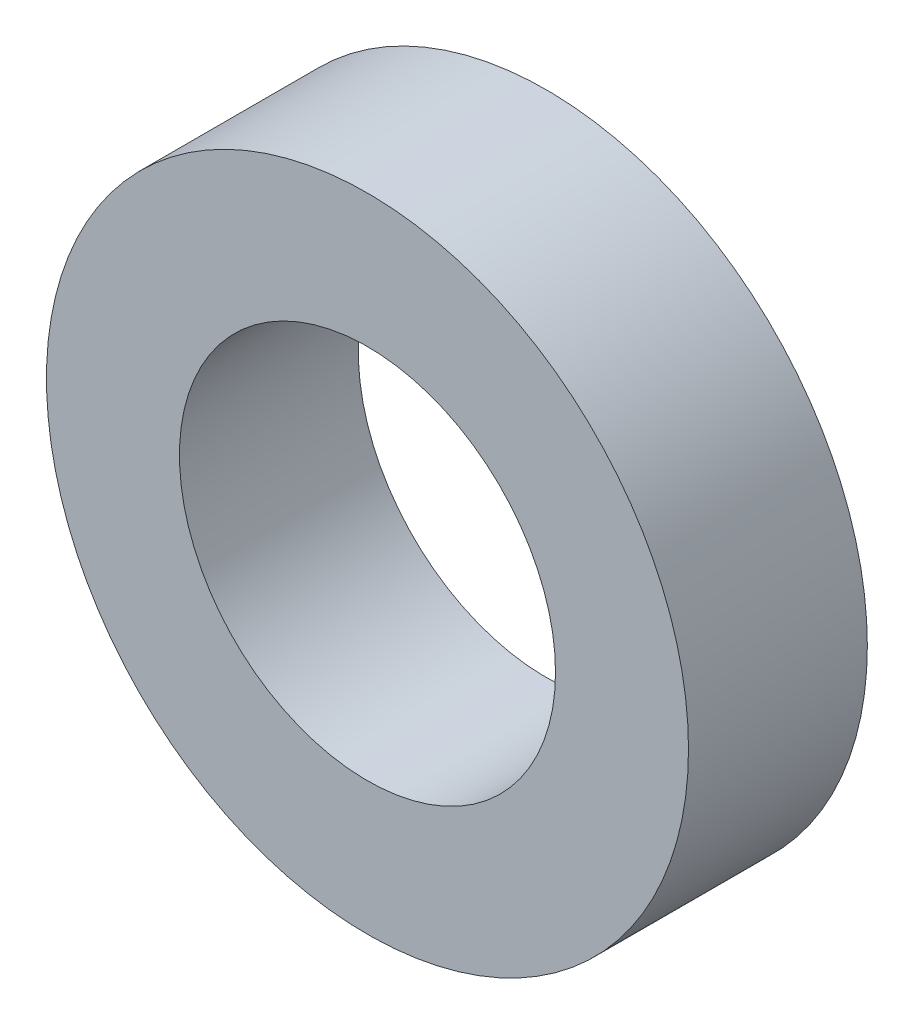
ISO-10303-21;
HEADER;
FILE_DESCRIPTION(('STEP AP214'),'2;1');
FILE_NAME('part.step','',(''),(''),'','','');
FILE_SCHEMA(('AUTOMOTIVE_DESIGN { 1 0 10303 214 1 1 1 1 }'));
ENDSEC;
DATA;
#1=APPLICATION_CONTEXT('core data for automotive mechanical design processes');
#2=APPLICATION_PROTOCOL_DEFINITION('international standard','automotive_design',2000,#1);
#3=PRODUCT_CONTEXT('',#1,'mechanical');
#4=PRODUCT('Part','Part','',(#3));
#5=PRODUCT_RELATED_PRODUCT_CATEGORY('part','',(#4));
#6=PRODUCT_DEFINITION_FORMATION('','',#4);
#7=PRODUCT_DEFINITION_CONTEXT('part definition',#1,'design');
#8=PRODUCT_DEFINITION('design','',#6,#7);
#9=PRODUCT_DEFINITION_SHAPE('','',#8);
#10=(LENGTH_UNIT() NAMED_UNIT(*) SI_UNIT(.MILLI.,.METRE.));
#11=(NAMED_UNIT(*) PLANE_ANGLE_UNIT() SI_UNIT($,.RADIAN.));
#12=(NAMED_UNIT(*) SI_UNIT($,.STERADIAN.) SOLID_ANGLE_UNIT());
#13=UNCERTAINTY_MEASURE_WITH_UNIT(LENGTH_MEASURE(1.E-05),#10,'distance_accuracy_value','');
#14=(GEOMETRIC_REPRESENTATION_CONTEXT(3) GLOBAL_UNCERTAINTY_ASSIGNED_CONTEXT((#13)) GLOBAL_UNIT_ASSIGNED_CONTEXT((#10,
#11,#12)) REPRESENTATION_CONTEXT('',''));
#15=CARTESIAN_POINT('',(0.,0.,0.));
#16=DIRECTION('',(0.,0.,1.));
#17=DIRECTION('',(1.,0.,0.));
#18=AXIS2_PLACEMENT_3D('',#15,#16,#17);
#19=CARTESIAN_POINT('',(0.,0.,7.9248));
#20=DIRECTION('',(0.,0.,-1.));
#21=DIRECTION('',(-1.,0.,0.));
#22=AXIS2_PLACEMENT_3D('',#19,#20,#21);
#23=CYLINDRICAL_SURFACE('',#22,14.224);
#24=CARTESIAN_POINT('',(0.,0.,7.9248));
#25=DIRECTION('',(0.,0.,1.));
#26=DIRECTION('',(1.,0.,0.));
#27=AXIS2_PLACEMENT_3D('',#24,#25,#26);
#28=CIRCLE('',#27,14.224);
#29=CARTESIAN_POINT('',(14.224,0.,7.9248));
#30=VERTEX_POINT('',#29);
#31=EDGE_CURVE('E10',#30,#30,#28,.T.);
#32=ORIENTED_EDGE('',*,*,#31,.F.);
#33=EDGE_LOOP('',(#32));
#34=FACE_BOUND('',#33,.T.);
#35=CARTESIAN_POINT('',(0.,0.,0.));
#36=DIRECTION('',(0.,0.,1.));
#37=DIRECTION('',(1.,0.,0.));
#38=AXIS2_PLACEMENT_3D('',#35,#36,#37);
#39=CIRCLE('',#38,14.224);
#40=CARTESIAN_POINT('',(14.224,0.,0.));
#41=VERTEX_POINT('',#40);
#42=EDGE_CURVE('E40',#41,#41,#39,.T.);
#43=ORIENTED_EDGE('',*,*,#42,.T.);
#44=EDGE_LOOP('',(#43));
#45=FACE_BOUND('',#44,.T.);
#46=ADVANCED_FACE('F37',(#34,#45),#23,.T.);
#47=CARTESIAN_POINT('',(0.,0.,7.9248));
#48=DIRECTION('',(0.,0.,1.));
#49=DIRECTION('',(1.,0.,0.));
#50=AXIS2_PLACEMENT_3D('',#47,#48,#49);
#51=PLANE('',#50);
#52=CARTESIAN_POINT('',(0.,0.,7.9248));
#53=DIRECTION('',(0.,0.,1.));
#54=DIRECTION('',(1.,0.,0.));
#55=AXIS2_PLACEMENT_3D('',#52,#53,#54);
#56=CIRCLE('',#55,8.3312);
#57=CARTESIAN_POINT('',(8.3312,0.,7.9248));
#58=VERTEX_POINT('',#57);
#59=EDGE_CURVE('E47',#58,#58,#56,.T.);
#60=ORIENTED_EDGE('',*,*,#59,.F.);
#61=EDGE_LOOP('',(#60));
#62=FACE_BOUND('',#61,.T.);
#63=ORIENTED_EDGE('',*,*,#31,.T.);
#64=EDGE_LOOP('',(#63));
#65=FACE_BOUND('',#64,.T.);
#66=ADVANCED_FACE('F58',(#62,#65),#51,.T.);
#67=CARTESIAN_POINT('',(0.,0.,0.));
#68=DIRECTION('',(0.,0.,1.));
#69=DIRECTION('',(1.,0.,0.));
#70=AXIS2_PLACEMENT_3D('',#67,#68,#69);
#71=PLANE('',#70);
#72=CARTESIAN_POINT('',(0.,0.,0.));
#73=DIRECTION('',(0.,0.,1.));
#74=DIRECTION('',(1.,0.,0.));
#75=AXIS2_PLACEMENT_3D('',#72,#73,#74);
#76=CIRCLE('',#75,8.3312);
#77=CARTESIAN_POINT('',(8.3312,0.,0.));
#78=VERTEX_POINT('',#77);
#79=EDGE_CURVE('E49',#78,#78,#76,.T.);
#80=ORIENTED_EDGE('',*,*,#79,.T.);
#81=EDGE_LOOP('',(#80));
#82=FACE_BOUND('',#81,.T.);
#83=ORIENTED_EDGE('',*,*,#42,.F.);
#84=EDGE_LOOP('',(#83));
#85=FACE_BOUND('',#84,.T.);
#86=ADVANCED_FACE('F60',(#82,#85),#71,.F.);
#87=CARTESIAN_POINT('',(0.,0.,7.9248));
#88=DIRECTION('',(0.,0.,-1.));
#89=DIRECTION('',(-1.,0.,0.));
#90=AXIS2_PLACEMENT_3D('',#87,#88,#89);
#91=CYLINDRICAL_SURFACE('',#90,8.3312);
#92=ORIENTED_EDGE('',*,*,#59,.T.);
#93=EDGE_LOOP('',(#92));
#94=FACE_BOUND('',#93,.T.);
#95=ORIENTED_EDGE('',*,*,#79,.F.);
#96=EDGE_LOOP('',(#95));
#97=FACE_BOUND('',#96,.T.);
#98=ADVANCED_FACE('F55',(#94,#97),#91,.F.);
#99=CLOSED_SHELL('',(#46,#66,#86,#98));
#100=MANIFOLD_SOLID_BREP('B2',#99);
#101=ADVANCED_BREP_SHAPE_REPRESENTATION('',(#18,#100),#14);
#102=SHAPE_DEFINITION_REPRESENTATION(#9,#101);
ENDSEC;
END-ISO-10303-21;
